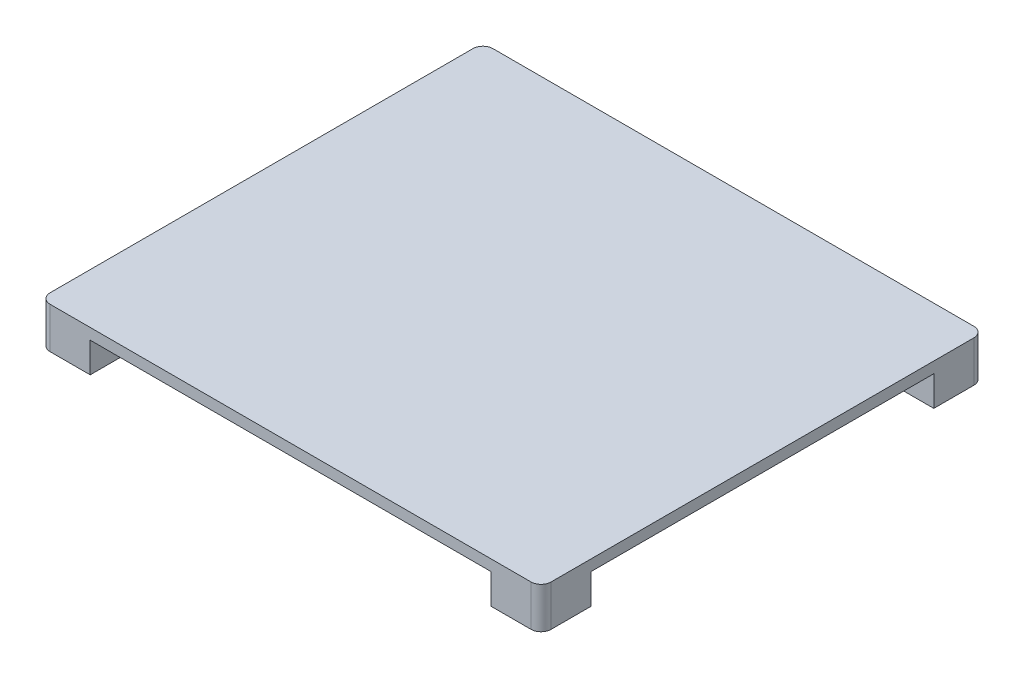
ISO-10303-21;
HEADER;
FILE_DESCRIPTION(('STEP AP214'),'2;1');
FILE_NAME('part.step','',(''),(''),'','','');
FILE_SCHEMA(('AUTOMOTIVE_DESIGN { 1 0 10303 214 1 1 1 1 }'));
ENDSEC;
DATA;
#1=APPLICATION_CONTEXT('core data for automotive mechanical design processes');
#2=APPLICATION_PROTOCOL_DEFINITION('international standard','automotive_design',2000,#1);
#3=PRODUCT_CONTEXT('',#1,'mechanical');
#4=PRODUCT('Part','Part','',(#3));
#5=PRODUCT_RELATED_PRODUCT_CATEGORY('part','',(#4));
#6=PRODUCT_DEFINITION_FORMATION('','',#4);
#7=PRODUCT_DEFINITION_CONTEXT('part definition',#1,'design');
#8=PRODUCT_DEFINITION('design','',#6,#7);
#9=PRODUCT_DEFINITION_SHAPE('','',#8);
#10=(LENGTH_UNIT() NAMED_UNIT(*) SI_UNIT(.MILLI.,.METRE.));
#11=(NAMED_UNIT(*) PLANE_ANGLE_UNIT() SI_UNIT($,.RADIAN.));
#12=(NAMED_UNIT(*) SI_UNIT($,.STERADIAN.) SOLID_ANGLE_UNIT());
#13=UNCERTAINTY_MEASURE_WITH_UNIT(LENGTH_MEASURE(1.E-05),#10,'distance_accuracy_value','');
#14=(GEOMETRIC_REPRESENTATION_CONTEXT(3) GLOBAL_UNCERTAINTY_ASSIGNED_CONTEXT((#13)) GLOBAL_UNIT_ASSIGNED_CONTEXT((#10,
#11,#12)) REPRESENTATION_CONTEXT('',''));
#15=CARTESIAN_POINT('',(0.,0.,0.));
#16=DIRECTION('',(0.,0.,1.));
#17=DIRECTION('',(1.,0.,0.));
#18=AXIS2_PLACEMENT_3D('',#15,#16,#17);
#19=CARTESIAN_POINT('',(0.,0.,0.));
#20=DIRECTION('',(0.,-1.,0.));
#21=DIRECTION('',(0.,0.,-1.));
#22=AXIS2_PLACEMENT_3D('',#19,#20,#21);
#23=PLANE('',#22);
#24=DIRECTION('',(0.,0.,1.));
#25=VECTOR('',#24,1.);
#26=CARTESIAN_POINT('',(100.,0.,90.5));
#27=LINE('',#26,#25);
#28=CARTESIAN_POINT('',(100.,0.,90.5));
#29=VERTEX_POINT('',#28);
#30=CARTESIAN_POINT('',(100.,0.,110.5));
#31=VERTEX_POINT('',#30);
#32=EDGE_CURVE('E272',#29,#31,#27,.T.);
#33=ORIENTED_EDGE('',*,*,#32,.T.);
#34=DIRECTION('',(1.,0.,0.));
#35=VECTOR('',#34,1.);
#36=CARTESIAN_POINT('',(-125.,0.,110.5));
#37=LINE('',#36,#35);
#38=CARTESIAN_POINT('',(-100.,0.,110.5));
#39=VERTEX_POINT('',#38);
#40=EDGE_CURVE('E436',#39,#31,#37,.T.);
#41=ORIENTED_EDGE('',*,*,#40,.F.);
#42=DIRECTION('',(0.,0.,1.));
#43=VECTOR('',#42,1.);
#44=CARTESIAN_POINT('',(-100.,0.,110.5));
#45=LINE('',#44,#43);
#46=CARTESIAN_POINT('',(-100.,0.,90.5));
#47=VERTEX_POINT('',#46);
#48=EDGE_CURVE('E395',#47,#39,#45,.T.);
#49=ORIENTED_EDGE('',*,*,#48,.F.);
#50=DIRECTION('',(1.,0.,0.));
#51=VECTOR('',#50,1.);
#52=CARTESIAN_POINT('',(-100.,0.,90.5));
#53=LINE('',#52,#51);
#54=CARTESIAN_POINT('',(-105.,0.,90.5));
#55=VERTEX_POINT('',#54);
#56=EDGE_CURVE('E412',#55,#47,#53,.T.);
#57=ORIENTED_EDGE('',*,*,#56,.F.);
#58=DIRECTION('',(0.,0.,1.));
#59=VECTOR('',#58,1.);
#60=CARTESIAN_POINT('',(-105.,0.,90.5));
#61=LINE('',#60,#59);
#62=CARTESIAN_POINT('',(-105.,0.,85.5));
#63=VERTEX_POINT('',#62);
#64=EDGE_CURVE('E409',#63,#55,#61,.T.);
#65=ORIENTED_EDGE('',*,*,#64,.F.);
#66=DIRECTION('',(1.,0.,0.));
#67=VECTOR('',#66,1.);
#68=CARTESIAN_POINT('',(-105.,0.,85.5));
#69=LINE('',#68,#67);
#70=CARTESIAN_POINT('',(-125.,0.,85.5));
#71=VERTEX_POINT('',#70);
#72=EDGE_CURVE('E391',#71,#63,#69,.T.);
#73=ORIENTED_EDGE('',*,*,#72,.F.);
#74=DIRECTION('',(0.,0.,1.));
#75=VECTOR('',#74,1.);
#76=CARTESIAN_POINT('',(-125.,0.,110.5));
#77=LINE('',#76,#75);
#78=CARTESIAN_POINT('',(-125.,0.,-85.5));
#79=VERTEX_POINT('',#78);
#80=EDGE_CURVE('E450',#79,#71,#77,.T.);
#81=ORIENTED_EDGE('',*,*,#80,.F.);
#82=DIRECTION('',(1.,0.,0.));
#83=VECTOR('',#82,1.);
#84=CARTESIAN_POINT('',(-105.,0.,-85.5));
#85=LINE('',#84,#83);
#86=CARTESIAN_POINT('',(-105.,0.,-85.5));
#87=VERTEX_POINT('',#86);
#88=EDGE_CURVE('E320',#79,#87,#85,.T.);
#89=ORIENTED_EDGE('',*,*,#88,.T.);
#90=DIRECTION('',(0.,0.,-1.));
#91=VECTOR('',#90,1.);
#92=CARTESIAN_POINT('',(-105.,0.,-90.5));
#93=LINE('',#92,#91);
#94=CARTESIAN_POINT('',(-105.,0.,-90.5));
#95=VERTEX_POINT('',#94);
#96=EDGE_CURVE('E341',#87,#95,#93,.T.);
#97=ORIENTED_EDGE('',*,*,#96,.T.);
#98=DIRECTION('',(1.,0.,0.));
#99=VECTOR('',#98,1.);
#100=CARTESIAN_POINT('',(-100.,0.,-90.5));
#101=LINE('',#100,#99);
#102=CARTESIAN_POINT('',(-100.,0.,-90.5));
#103=VERTEX_POINT('',#102);
#104=EDGE_CURVE('E338',#95,#103,#101,.T.);
#105=ORIENTED_EDGE('',*,*,#104,.T.);
#106=DIRECTION('',(0.,0.,-1.));
#107=VECTOR('',#106,1.);
#108=CARTESIAN_POINT('',(-100.,0.,-110.5));
#109=LINE('',#108,#107);
#110=CARTESIAN_POINT('',(-100.,0.,-110.5));
#111=VERTEX_POINT('',#110);
#112=EDGE_CURVE('E316',#103,#111,#109,.T.);
#113=ORIENTED_EDGE('',*,*,#112,.T.);
#114=DIRECTION('',(-1.,0.,0.));
#115=VECTOR('',#114,1.);
#116=CARTESIAN_POINT('',(-125.,0.,-110.5));
#117=LINE('',#116,#115);
#118=CARTESIAN_POINT('',(100.,0.,-110.5));
#119=VERTEX_POINT('',#118);
#120=EDGE_CURVE('E447',#119,#111,#117,.T.);
#121=ORIENTED_EDGE('',*,*,#120,.F.);
#122=DIRECTION('',(0.,0.,-1.));
#123=VECTOR('',#122,1.);
#124=CARTESIAN_POINT('',(100.,0.,-90.5));
#125=LINE('',#124,#123);
#126=CARTESIAN_POINT('',(100.,0.,-90.5));
#127=VERTEX_POINT('',#126);
#128=EDGE_CURVE('E360',#127,#119,#125,.T.);
#129=ORIENTED_EDGE('',*,*,#128,.F.);
#130=DIRECTION('',(-1.,0.,0.));
#131=VECTOR('',#130,1.);
#132=CARTESIAN_POINT('',(105.,0.,-90.5));
#133=LINE('',#132,#131);
#134=CARTESIAN_POINT('',(105.,0.,-90.5));
#135=VERTEX_POINT('',#134);
#136=EDGE_CURVE('E374',#135,#127,#133,.T.);
#137=ORIENTED_EDGE('',*,*,#136,.F.);
#138=DIRECTION('',(0.,0.,-1.));
#139=VECTOR('',#138,1.);
#140=CARTESIAN_POINT('',(105.,0.,-85.5));
#141=LINE('',#140,#139);
#142=CARTESIAN_POINT('',(105.,0.,-85.5));
#143=VERTEX_POINT('',#142);
#144=EDGE_CURVE('E372',#143,#135,#141,.T.);
#145=ORIENTED_EDGE('',*,*,#144,.F.);
#146=DIRECTION('',(-1.,0.,0.));
#147=VECTOR('',#146,1.);
#148=CARTESIAN_POINT('',(125.,0.,-85.5));
#149=LINE('',#148,#147);
#150=CARTESIAN_POINT('',(125.,0.,-85.5));
#151=VERTEX_POINT('',#150);
#152=EDGE_CURVE('E356',#151,#143,#149,.T.);
#153=ORIENTED_EDGE('',*,*,#152,.F.);
#154=DIRECTION('',(0.,0.,-1.));
#155=VECTOR('',#154,1.);
#156=CARTESIAN_POINT('',(125.,0.,110.5));
#157=LINE('',#156,#155);
#158=CARTESIAN_POINT('',(125.,0.,85.5));
#159=VERTEX_POINT('',#158);
#160=EDGE_CURVE('E431',#159,#151,#157,.T.);
#161=ORIENTED_EDGE('',*,*,#160,.F.);
#162=DIRECTION('',(-1.,0.,0.));
#163=VECTOR('',#162,1.);
#164=CARTESIAN_POINT('',(125.,0.,85.5));
#165=LINE('',#164,#163);
#166=CARTESIAN_POINT('',(105.,0.,85.5));
#167=VERTEX_POINT('',#166);
#168=EDGE_CURVE('E285',#159,#167,#165,.T.);
#169=ORIENTED_EDGE('',*,*,#168,.T.);
#170=DIRECTION('',(0.,0.,1.));
#171=VECTOR('',#170,1.);
#172=CARTESIAN_POINT('',(105.,0.,85.5));
#173=LINE('',#172,#171);
#174=CARTESIAN_POINT('',(105.,0.,90.5));
#175=VERTEX_POINT('',#174);
#176=EDGE_CURVE('E302',#167,#175,#173,.T.);
#177=ORIENTED_EDGE('',*,*,#176,.T.);
#178=DIRECTION('',(-1.,0.,0.));
#179=VECTOR('',#178,1.);
#180=CARTESIAN_POINT('',(105.,0.,90.5));
#181=LINE('',#180,#179);
#182=EDGE_CURVE('E275',#175,#29,#181,.T.);
#183=ORIENTED_EDGE('',*,*,#182,.T.);
#184=EDGE_LOOP('',(#33,#41,#49,#57,#65,#73,#81,#89,#97,#105,#113,#121,#129,#137,#145,#153,#161,
#169,#177,#183));
#185=FACE_BOUND('',#184,.T.);
#186=DIRECTION('',(-1.,0.,0.));
#187=VECTOR('',#186,1.);
#188=CARTESIAN_POINT('',(-75.,0.,50.));
#189=LINE('',#188,#187);
#190=CARTESIAN_POINT('',(75.,0.,50.));
#191=VERTEX_POINT('',#190);
#192=CARTESIAN_POINT('',(-75.,0.,50.));
#193=VERTEX_POINT('',#192);
#194=EDGE_CURVE('E852',#191,#193,#189,.T.);
#195=ORIENTED_EDGE('',*,*,#194,.F.);
#196=DIRECTION('',(0.,0.,1.));
#197=VECTOR('',#196,1.);
#198=CARTESIAN_POINT('',(75.,0.,-50.));
#199=LINE('',#198,#197);
#200=CARTESIAN_POINT('',(75.,0.,-50.));
#201=VERTEX_POINT('',#200);
#202=EDGE_CURVE('E270',#201,#191,#199,.T.);
#203=ORIENTED_EDGE('',*,*,#202,.F.);
#204=DIRECTION('',(1.,0.,0.));
#205=VECTOR('',#204,1.);
#206=CARTESIAN_POINT('',(-75.,0.,-50.));
#207=LINE('',#206,#205);
#208=CARTESIAN_POINT('',(-75.,0.,-50.));
#209=VERTEX_POINT('',#208);
#210=EDGE_CURVE('E266',#209,#201,#207,.T.);
#211=ORIENTED_EDGE('',*,*,#210,.F.);
#212=DIRECTION('',(0.,0.,-1.));
#213=VECTOR('',#212,1.);
#214=CARTESIAN_POINT('',(-75.,0.,-50.));
#215=LINE('',#214,#213);
#216=EDGE_CURVE('E850',#193,#209,#215,.T.);
#217=ORIENTED_EDGE('',*,*,#216,.F.);
#218=EDGE_LOOP('',(#195,#203,#211,#217));
#219=FACE_BOUND('',#218,.T.);
#220=ADVANCED_FACE('F39',(#185,#219),#23,.T.);
#221=CARTESIAN_POINT('',(125.,5.5,110.5));
#222=DIRECTION('',(-1.,0.,0.));
#223=DIRECTION('',(0.,0.,1.));
#224=AXIS2_PLACEMENT_3D('',#221,#222,#223);
#225=PLANE('',#224);
#226=DIRECTION('',(0.,0.,1.));
#227=VECTOR('',#226,1.);
#228=CARTESIAN_POINT('',(125.,-15.,-110.5));
#229=LINE('',#228,#227);
#230=CARTESIAN_POINT('',(125.,-15.,-105.5));
#231=VERTEX_POINT('',#230);
#232=CARTESIAN_POINT('',(125.,-15.,-85.5));
#233=VERTEX_POINT('',#232);
#234=EDGE_CURVE('E359',#231,#233,#229,.T.);
#235=ORIENTED_EDGE('',*,*,#234,.F.);
#236=DIRECTION('',(0.,-1.,0.));
#237=VECTOR('',#236,1.);
#238=CARTESIAN_POINT('',(125.,5.5,-105.5));
#239=LINE('',#238,#237);
#240=CARTESIAN_POINT('',(125.,5.5,-105.5));
#241=VERTEX_POINT('',#240);
#242=EDGE_CURVE('E47',#231,#241,#239,.F.);
#243=ORIENTED_EDGE('',*,*,#242,.T.);
#244=DIRECTION('',(0.,0.,-1.));
#245=VECTOR('',#244,1.);
#246=CARTESIAN_POINT('',(125.,5.5,110.5));
#247=LINE('',#246,#245);
#248=CARTESIAN_POINT('',(125.,5.5,105.5));
#249=VERTEX_POINT('',#248);
#250=EDGE_CURVE('E432',#249,#241,#247,.T.);
#251=ORIENTED_EDGE('',*,*,#250,.F.);
#252=DIRECTION('',(0.,-1.,0.));
#253=VECTOR('',#252,1.);
#254=CARTESIAN_POINT('',(125.,5.5,105.5));
#255=LINE('',#254,#253);
#256=CARTESIAN_POINT('',(125.,-15.,105.5));
#257=VERTEX_POINT('',#256);
#258=EDGE_CURVE('E481',#249,#257,#255,.T.);
#259=ORIENTED_EDGE('',*,*,#258,.T.);
#260=DIRECTION('',(0.,0.,-1.));
#261=VECTOR('',#260,1.);
#262=CARTESIAN_POINT('',(125.,-15.,110.5));
#263=LINE('',#262,#261);
#264=CARTESIAN_POINT('',(125.,-15.,85.5));
#265=VERTEX_POINT('',#264);
#266=EDGE_CURVE('E297',#257,#265,#263,.T.);
#267=ORIENTED_EDGE('',*,*,#266,.T.);
#268=DIRECTION('',(0.,1.,0.));
#269=VECTOR('',#268,1.);
#270=CARTESIAN_POINT('',(125.,-15.,85.5));
#271=LINE('',#270,#269);
#272=EDGE_CURVE('E298',#265,#159,#271,.T.);
#273=ORIENTED_EDGE('',*,*,#272,.T.);
#274=ORIENTED_EDGE('',*,*,#160,.T.);
#275=DIRECTION('',(0.,1.,0.));
#276=VECTOR('',#275,1.);
#277=CARTESIAN_POINT('',(125.,-15.,-85.5));
#278=LINE('',#277,#276);
#279=EDGE_CURVE('E388',#233,#151,#278,.T.);
#280=ORIENTED_EDGE('',*,*,#279,.F.);
#281=EDGE_LOOP('',(#235,#243,#251,#259,#267,#273,#274,#280));
#282=FACE_BOUND('',#281,.T.);
#283=ADVANCED_FACE('F485',(#282),#225,.F.);
#284=CARTESIAN_POINT('',(-125.,5.5,-110.5));
#285=DIRECTION('',(0.,0.,1.));
#286=DIRECTION('',(1.,0.,0.));
#287=AXIS2_PLACEMENT_3D('',#284,#285,#286);
#288=PLANE('',#287);
#289=DIRECTION('',(-1.,0.,0.));
#290=VECTOR('',#289,1.);
#291=CARTESIAN_POINT('',(-125.,-15.,-110.5));
#292=LINE('',#291,#290);
#293=CARTESIAN_POINT('',(-100.,-15.,-110.5));
#294=VERTEX_POINT('',#293);
#295=CARTESIAN_POINT('',(-120.,-15.,-110.5));
#296=VERTEX_POINT('',#295);
#297=EDGE_CURVE('E319',#294,#296,#292,.T.);
#298=ORIENTED_EDGE('',*,*,#297,.T.);
#299=DIRECTION('',(0.,-1.,0.));
#300=VECTOR('',#299,1.);
#301=CARTESIAN_POINT('',(-120.,5.5,-110.5));
#302=LINE('',#301,#300);
#303=CARTESIAN_POINT('',(-120.,5.5,-110.5));
#304=VERTEX_POINT('',#303);
#305=EDGE_CURVE('E478',#296,#304,#302,.F.);
#306=ORIENTED_EDGE('',*,*,#305,.T.);
#307=DIRECTION('',(-1.,0.,0.));
#308=VECTOR('',#307,1.);
#309=CARTESIAN_POINT('',(-125.,5.5,-110.5));
#310=LINE('',#309,#308);
#311=CARTESIAN_POINT('',(120.,5.5,-110.5));
#312=VERTEX_POINT('',#311);
#313=EDGE_CURVE('E435',#312,#304,#310,.T.);
#314=ORIENTED_EDGE('',*,*,#313,.F.);
#315=DIRECTION('',(0.,-1.,0.));
#316=VECTOR('',#315,1.);
#317=CARTESIAN_POINT('',(120.,5.5,-110.5));
#318=LINE('',#317,#316);
#319=CARTESIAN_POINT('',(120.,-15.,-110.5));
#320=VERTEX_POINT('',#319);
#321=EDGE_CURVE('E475',#312,#320,#318,.T.);
#322=ORIENTED_EDGE('',*,*,#321,.T.);
#323=DIRECTION('',(1.,0.,0.));
#324=VECTOR('',#323,1.);
#325=CARTESIAN_POINT('',(100.,-15.,-110.5));
#326=LINE('',#325,#324);
#327=CARTESIAN_POINT('',(100.,-15.,-110.5));
#328=VERTEX_POINT('',#327);
#329=EDGE_CURVE('E357',#328,#320,#326,.T.);
#330=ORIENTED_EDGE('',*,*,#329,.F.);
#331=DIRECTION('',(0.,1.,0.));
#332=VECTOR('',#331,1.);
#333=CARTESIAN_POINT('',(100.,-15.,-110.5));
#334=LINE('',#333,#332);
#335=EDGE_CURVE('E370',#328,#119,#334,.T.);
#336=ORIENTED_EDGE('',*,*,#335,.T.);
#337=ORIENTED_EDGE('',*,*,#120,.T.);
#338=DIRECTION('',(0.,1.,0.));
#339=VECTOR('',#338,1.);
#340=CARTESIAN_POINT('',(-100.,-15.,-110.5));
#341=LINE('',#340,#339);
#342=EDGE_CURVE('E354',#294,#111,#341,.T.);
#343=ORIENTED_EDGE('',*,*,#342,.F.);
#344=EDGE_LOOP('',(#298,#306,#314,#322,#330,#336,#337,#343));
#345=FACE_BOUND('',#344,.T.);
#346=ADVANCED_FACE('F497',(#345),#288,.F.);
#347=CARTESIAN_POINT('',(-125.,5.5,110.5));
#348=DIRECTION('',(1.,0.,0.));
#349=DIRECTION('',(0.,0.,-1.));
#350=AXIS2_PLACEMENT_3D('',#347,#348,#349);
#351=PLANE('',#350);
#352=DIRECTION('',(0.,0.,-1.));
#353=VECTOR('',#352,1.);
#354=CARTESIAN_POINT('',(-125.,-15.,85.5));
#355=LINE('',#354,#353);
#356=CARTESIAN_POINT('',(-125.,-15.,105.5));
#357=VERTEX_POINT('',#356);
#358=CARTESIAN_POINT('',(-125.,-15.,85.5));
#359=VERTEX_POINT('',#358);
#360=EDGE_CURVE('E392',#357,#359,#355,.T.);
#361=ORIENTED_EDGE('',*,*,#360,.F.);
#362=DIRECTION('',(0.,-1.,0.));
#363=VECTOR('',#362,1.);
#364=CARTESIAN_POINT('',(-125.,5.5,105.5));
#365=LINE('',#364,#363);
#366=CARTESIAN_POINT('',(-125.,5.5,105.5));
#367=VERTEX_POINT('',#366);
#368=EDGE_CURVE('E463',#357,#367,#365,.F.);
#369=ORIENTED_EDGE('',*,*,#368,.T.);
#370=DIRECTION('',(0.,0.,1.));
#371=VECTOR('',#370,1.);
#372=CARTESIAN_POINT('',(-125.,5.5,110.5));
#373=LINE('',#372,#371);
#374=CARTESIAN_POINT('',(-125.,5.5,-105.5));
#375=VERTEX_POINT('',#374);
#376=EDGE_CURVE('E439',#375,#367,#373,.T.);
#377=ORIENTED_EDGE('',*,*,#376,.F.);
#378=DIRECTION('',(0.,-1.,0.));
#379=VECTOR('',#378,1.);
#380=CARTESIAN_POINT('',(-125.,5.5,-105.5));
#381=LINE('',#380,#379);
#382=CARTESIAN_POINT('',(-125.,-15.,-105.5));
#383=VERTEX_POINT('',#382);
#384=EDGE_CURVE('E460',#375,#383,#381,.T.);
#385=ORIENTED_EDGE('',*,*,#384,.T.);
#386=DIRECTION('',(0.,0.,1.));
#387=VECTOR('',#386,1.);
#388=CARTESIAN_POINT('',(-125.,-15.,-85.5));
#389=LINE('',#388,#387);
#390=CARTESIAN_POINT('',(-125.,-15.,-85.5));
#391=VERTEX_POINT('',#390);
#392=EDGE_CURVE('E317',#383,#391,#389,.T.);
#393=ORIENTED_EDGE('',*,*,#392,.T.);
#394=DIRECTION('',(0.,1.,0.));
#395=VECTOR('',#394,1.);
#396=CARTESIAN_POINT('',(-125.,-15.,-85.5));
#397=LINE('',#396,#395);
#398=EDGE_CURVE('E335',#391,#79,#397,.T.);
#399=ORIENTED_EDGE('',*,*,#398,.T.);
#400=ORIENTED_EDGE('',*,*,#80,.T.);
#401=DIRECTION('',(0.,1.,0.));
#402=VECTOR('',#401,1.);
#403=CARTESIAN_POINT('',(-125.,-15.,85.5));
#404=LINE('',#403,#402);
#405=EDGE_CURVE('E428',#359,#71,#404,.T.);
#406=ORIENTED_EDGE('',*,*,#405,.F.);
#407=EDGE_LOOP('',(#361,#369,#377,#385,#393,#399,#400,#406));
#408=FACE_BOUND('',#407,.T.);
#409=ADVANCED_FACE('F529',(#408),#351,.F.);
#410=CARTESIAN_POINT('',(-125.,5.5,110.5));
#411=DIRECTION('',(0.,0.,-1.));
#412=DIRECTION('',(-1.,0.,0.));
#413=AXIS2_PLACEMENT_3D('',#410,#411,#412);
#414=PLANE('',#413);
#415=DIRECTION('',(1.,0.,0.));
#416=VECTOR('',#415,1.);
#417=CARTESIAN_POINT('',(-125.,5.5,110.5));
#418=LINE('',#417,#416);
#419=CARTESIAN_POINT('',(-120.,5.5,110.5));
#420=VERTEX_POINT('',#419);
#421=CARTESIAN_POINT('',(120.,5.5,110.5));
#422=VERTEX_POINT('',#421);
#423=EDGE_CURVE('E442',#420,#422,#418,.T.);
#424=ORIENTED_EDGE('',*,*,#423,.F.);
#425=DIRECTION('',(0.,-1.,0.));
#426=VECTOR('',#425,1.);
#427=CARTESIAN_POINT('',(-120.,5.5,110.5));
#428=LINE('',#427,#426);
#429=CARTESIAN_POINT('',(-120.,-15.,110.5));
#430=VERTEX_POINT('',#429);
#431=EDGE_CURVE('E455',#420,#430,#428,.T.);
#432=ORIENTED_EDGE('',*,*,#431,.T.);
#433=DIRECTION('',(-1.,0.,0.));
#434=VECTOR('',#433,1.);
#435=CARTESIAN_POINT('',(-125.,-15.,110.5));
#436=LINE('',#435,#434);
#437=CARTESIAN_POINT('',(-100.,-15.,110.5));
#438=VERTEX_POINT('',#437);
#439=EDGE_CURVE('E403',#438,#430,#436,.T.);
#440=ORIENTED_EDGE('',*,*,#439,.F.);
#441=DIRECTION('',(0.,1.,0.));
#442=VECTOR('',#441,1.);
#443=CARTESIAN_POINT('',(-100.,-15.,110.5));
#444=LINE('',#443,#442);
#445=EDGE_CURVE('E406',#438,#39,#444,.T.);
#446=ORIENTED_EDGE('',*,*,#445,.T.);
#447=ORIENTED_EDGE('',*,*,#40,.T.);
#448=DIRECTION('',(0.,1.,0.));
#449=VECTOR('',#448,1.);
#450=CARTESIAN_POINT('',(100.,-15.,110.5));
#451=LINE('',#450,#449);
#452=CARTESIAN_POINT('',(100.,-15.,110.5));
#453=VERTEX_POINT('',#452);
#454=EDGE_CURVE('E314',#453,#31,#451,.T.);
#455=ORIENTED_EDGE('',*,*,#454,.F.);
#456=DIRECTION('',(1.,0.,0.));
#457=VECTOR('',#456,1.);
#458=CARTESIAN_POINT('',(100.,-15.,110.5));
#459=LINE('',#458,#457);
#460=CARTESIAN_POINT('',(120.,-15.,110.5));
#461=VERTEX_POINT('',#460);
#462=EDGE_CURVE('E281',#453,#461,#459,.T.);
#463=ORIENTED_EDGE('',*,*,#462,.T.);
#464=DIRECTION('',(0.,-1.,0.));
#465=VECTOR('',#464,1.);
#466=CARTESIAN_POINT('',(120.,5.5,110.5));
#467=LINE('',#466,#465);
#468=EDGE_CURVE('E445',#461,#422,#467,.F.);
#469=ORIENTED_EDGE('',*,*,#468,.T.);
#470=EDGE_LOOP('',(#424,#432,#440,#446,#447,#455,#463,#469));
#471=FACE_BOUND('',#470,.T.);
#472=ADVANCED_FACE('F539',(#471),#414,.F.);
#473=CARTESIAN_POINT('',(0.,5.5,0.));
#474=DIRECTION('',(0.,-1.,0.));
#475=DIRECTION('',(0.,0.,-1.));
#476=AXIS2_PLACEMENT_3D('',#473,#474,#475);
#477=PLANE('',#476);
#478=ORIENTED_EDGE('',*,*,#376,.T.);
#479=CARTESIAN_POINT('',(-120.,5.5,105.5));
#480=DIRECTION('',(0.,-1.,0.));
#481=DIRECTION('',(0.,0.,-1.));
#482=AXIS2_PLACEMENT_3D('',#479,#480,#481);
#483=CIRCLE('',#482,5.);
#484=EDGE_CURVE('E471',#367,#420,#483,.F.);
#485=ORIENTED_EDGE('',*,*,#484,.T.);
#486=ORIENTED_EDGE('',*,*,#423,.T.);
#487=CARTESIAN_POINT('',(120.,5.5,105.5));
#488=DIRECTION('',(0.,-1.,0.));
#489=DIRECTION('',(0.,0.,-1.));
#490=AXIS2_PLACEMENT_3D('',#487,#488,#489);
#491=CIRCLE('',#490,5.);
#492=EDGE_CURVE('E465',#422,#249,#491,.F.);
#493=ORIENTED_EDGE('',*,*,#492,.T.);
#494=ORIENTED_EDGE('',*,*,#250,.T.);
#495=CARTESIAN_POINT('',(120.,5.5,-105.5));
#496=DIRECTION('',(0.,-1.,0.));
#497=DIRECTION('',(0.,0.,-1.));
#498=AXIS2_PLACEMENT_3D('',#495,#496,#497);
#499=CIRCLE('',#498,5.);
#500=EDGE_CURVE('E467',#241,#312,#499,.F.);
#501=ORIENTED_EDGE('',*,*,#500,.T.);
#502=ORIENTED_EDGE('',*,*,#313,.T.);
#503=CARTESIAN_POINT('',(-120.,5.5,-105.5));
#504=DIRECTION('',(0.,-1.,0.));
#505=DIRECTION('',(0.,0.,-1.));
#506=AXIS2_PLACEMENT_3D('',#503,#504,#505);
#507=CIRCLE('',#506,5.);
#508=EDGE_CURVE('E469',#304,#375,#507,.F.);
#509=ORIENTED_EDGE('',*,*,#508,.T.);
#510=EDGE_LOOP('',(#478,#485,#486,#493,#494,#501,#502,#509));
#511=FACE_BOUND('',#510,.T.);
#512=ADVANCED_FACE('F490',(#511),#477,.F.);
#513=CARTESIAN_POINT('',(-105.,-15.,85.5));
#514=DIRECTION('',(0.,0.,1.));
#515=DIRECTION('',(1.,0.,0.));
#516=AXIS2_PLACEMENT_3D('',#513,#514,#515);
#517=PLANE('',#516);
#518=ORIENTED_EDGE('',*,*,#72,.T.);
#519=DIRECTION('',(0.,1.,0.));
#520=VECTOR('',#519,1.);
#521=CARTESIAN_POINT('',(-105.,-15.,85.5));
#522=LINE('',#521,#520);
#523=CARTESIAN_POINT('',(-105.,-15.,85.5));
#524=VERTEX_POINT('',#523);
#525=EDGE_CURVE('E425',#524,#63,#522,.T.);
#526=ORIENTED_EDGE('',*,*,#525,.F.);
#527=DIRECTION('',(1.,0.,0.));
#528=VECTOR('',#527,1.);
#529=CARTESIAN_POINT('',(-105.,-15.,85.5));
#530=LINE('',#529,#528);
#531=EDGE_CURVE('E394',#359,#524,#530,.T.);
#532=ORIENTED_EDGE('',*,*,#531,.F.);
#533=ORIENTED_EDGE('',*,*,#405,.T.);
#534=EDGE_LOOP('',(#518,#526,#532,#533));
#535=FACE_BOUND('',#534,.T.);
#536=ADVANCED_FACE('F812',(#535),#517,.F.);
#537=CARTESIAN_POINT('',(-105.,-15.,90.5));
#538=DIRECTION('',(-1.,0.,0.));
#539=DIRECTION('',(0.,0.,1.));
#540=AXIS2_PLACEMENT_3D('',#537,#538,#539);
#541=PLANE('',#540);
#542=ORIENTED_EDGE('',*,*,#64,.T.);
#543=DIRECTION('',(0.,1.,0.));
#544=VECTOR('',#543,1.);
#545=CARTESIAN_POINT('',(-105.,-15.,90.5));
#546=LINE('',#545,#544);
#547=CARTESIAN_POINT('',(-105.,-15.,90.5));
#548=VERTEX_POINT('',#547);
#549=EDGE_CURVE('E422',#548,#55,#546,.T.);
#550=ORIENTED_EDGE('',*,*,#549,.F.);
#551=DIRECTION('',(0.,0.,1.));
#552=VECTOR('',#551,1.);
#553=CARTESIAN_POINT('',(-105.,-15.,90.5));
#554=LINE('',#553,#552);
#555=EDGE_CURVE('E397',#524,#548,#554,.T.);
#556=ORIENTED_EDGE('',*,*,#555,.F.);
#557=ORIENTED_EDGE('',*,*,#525,.T.);
#558=EDGE_LOOP('',(#542,#550,#556,#557));
#559=FACE_BOUND('',#558,.T.);
#560=ADVANCED_FACE('F805',(#559),#541,.F.);
#561=CARTESIAN_POINT('',(-100.,-15.,90.5));
#562=DIRECTION('',(0.,0.,1.));
#563=DIRECTION('',(1.,0.,0.));
#564=AXIS2_PLACEMENT_3D('',#561,#562,#563);
#565=PLANE('',#564);
#566=ORIENTED_EDGE('',*,*,#56,.T.);
#567=DIRECTION('',(0.,1.,0.));
#568=VECTOR('',#567,1.);
#569=CARTESIAN_POINT('',(-100.,-15.,90.5));
#570=LINE('',#569,#568);
#571=CARTESIAN_POINT('',(-100.,-15.,90.5));
#572=VERTEX_POINT('',#571);
#573=EDGE_CURVE('E419',#572,#47,#570,.T.);
#574=ORIENTED_EDGE('',*,*,#573,.F.);
#575=DIRECTION('',(1.,0.,0.));
#576=VECTOR('',#575,1.);
#577=CARTESIAN_POINT('',(-100.,-15.,90.5));
#578=LINE('',#577,#576);
#579=EDGE_CURVE('E399',#548,#572,#578,.T.);
#580=ORIENTED_EDGE('',*,*,#579,.F.);
#581=ORIENTED_EDGE('',*,*,#549,.T.);
#582=EDGE_LOOP('',(#566,#574,#580,#581));
#583=FACE_BOUND('',#582,.T.);
#584=ADVANCED_FACE('F798',(#583),#565,.F.);
#585=CARTESIAN_POINT('',(-100.,-15.,110.5));
#586=DIRECTION('',(-1.,0.,0.));
#587=DIRECTION('',(0.,0.,1.));
#588=AXIS2_PLACEMENT_3D('',#585,#586,#587);
#589=PLANE('',#588);
#590=ORIENTED_EDGE('',*,*,#48,.T.);
#591=ORIENTED_EDGE('',*,*,#445,.F.);
#592=DIRECTION('',(0.,0.,1.));
#593=VECTOR('',#592,1.);
#594=CARTESIAN_POINT('',(-100.,-15.,110.5));
#595=LINE('',#594,#593);
#596=EDGE_CURVE('E401',#572,#438,#595,.T.);
#597=ORIENTED_EDGE('',*,*,#596,.F.);
#598=ORIENTED_EDGE('',*,*,#573,.T.);
#599=EDGE_LOOP('',(#590,#591,#597,#598));
#600=FACE_BOUND('',#599,.T.);
#601=ADVANCED_FACE('F547',(#600),#589,.F.);
#602=CARTESIAN_POINT('',(0.,-15.,0.));
#603=DIRECTION('',(0.,1.,0.));
#604=DIRECTION('',(0.,0.,1.));
#605=AXIS2_PLACEMENT_3D('',#602,#603,#604);
#606=PLANE('',#605);
#607=ORIENTED_EDGE('',*,*,#439,.T.);
#608=CARTESIAN_POINT('',(-120.,-15.,105.5));
#609=DIRECTION('',(0.,1.,0.));
#610=DIRECTION('',(0.,0.,1.));
#611=AXIS2_PLACEMENT_3D('',#608,#609,#610);
#612=CIRCLE('',#611,5.);
#613=EDGE_CURVE('E458',#430,#357,#612,.F.);
#614=ORIENTED_EDGE('',*,*,#613,.T.);
#615=ORIENTED_EDGE('',*,*,#360,.T.);
#616=ORIENTED_EDGE('',*,*,#531,.T.);
#617=ORIENTED_EDGE('',*,*,#555,.T.);
#618=ORIENTED_EDGE('',*,*,#579,.T.);
#619=ORIENTED_EDGE('',*,*,#596,.T.);
#620=EDGE_LOOP('',(#607,#614,#615,#616,#617,#618,#619));
#621=FACE_BOUND('',#620,.T.);
#622=ADVANCED_FACE('F541',(#621),#606,.F.);
#623=CARTESIAN_POINT('',(125.,-15.,-85.5));
#624=DIRECTION('',(0.,0.,-1.));
#625=DIRECTION('',(-1.,0.,0.));
#626=AXIS2_PLACEMENT_3D('',#623,#624,#625);
#627=PLANE('',#626);
#628=ORIENTED_EDGE('',*,*,#152,.T.);
#629=DIRECTION('',(0.,1.,0.));
#630=VECTOR('',#629,1.);
#631=CARTESIAN_POINT('',(105.,-15.,-85.5));
#632=LINE('',#631,#630);
#633=CARTESIAN_POINT('',(105.,-15.,-85.5));
#634=VERTEX_POINT('',#633);
#635=EDGE_CURVE('E385',#634,#143,#632,.T.);
#636=ORIENTED_EDGE('',*,*,#635,.F.);
#637=DIRECTION('',(-1.,0.,0.));
#638=VECTOR('',#637,1.);
#639=CARTESIAN_POINT('',(125.,-15.,-85.5));
#640=LINE('',#639,#638);
#641=EDGE_CURVE('E362',#233,#634,#640,.T.);
#642=ORIENTED_EDGE('',*,*,#641,.F.);
#643=ORIENTED_EDGE('',*,*,#279,.T.);
#644=EDGE_LOOP('',(#628,#636,#642,#643));
#645=FACE_BOUND('',#644,.T.);
#646=ADVANCED_FACE('F778',(#645),#627,.F.);
#647=CARTESIAN_POINT('',(105.,-15.,-85.5));
#648=DIRECTION('',(1.,0.,0.));
#649=DIRECTION('',(0.,0.,-1.));
#650=AXIS2_PLACEMENT_3D('',#647,#648,#649);
#651=PLANE('',#650);
#652=ORIENTED_EDGE('',*,*,#144,.T.);
#653=DIRECTION('',(0.,1.,0.));
#654=VECTOR('',#653,1.);
#655=CARTESIAN_POINT('',(105.,-15.,-90.5));
#656=LINE('',#655,#654);
#657=CARTESIAN_POINT('',(105.,-15.,-90.5));
#658=VERTEX_POINT('',#657);
#659=EDGE_CURVE('E382',#658,#135,#656,.T.);
#660=ORIENTED_EDGE('',*,*,#659,.F.);
#661=DIRECTION('',(0.,0.,-1.));
#662=VECTOR('',#661,1.);
#663=CARTESIAN_POINT('',(105.,-15.,-85.5));
#664=LINE('',#663,#662);
#665=EDGE_CURVE('E364',#634,#658,#664,.T.);
#666=ORIENTED_EDGE('',*,*,#665,.F.);
#667=ORIENTED_EDGE('',*,*,#635,.T.);
#668=EDGE_LOOP('',(#652,#660,#666,#667));
#669=FACE_BOUND('',#668,.T.);
#670=ADVANCED_FACE('F770',(#669),#651,.F.);
#671=CARTESIAN_POINT('',(105.,-15.,-90.5));
#672=DIRECTION('',(0.,0.,-1.));
#673=DIRECTION('',(-1.,0.,0.));
#674=AXIS2_PLACEMENT_3D('',#671,#672,#673);
#675=PLANE('',#674);
#676=ORIENTED_EDGE('',*,*,#136,.T.);
#677=DIRECTION('',(0.,1.,0.));
#678=VECTOR('',#677,1.);
#679=CARTESIAN_POINT('',(100.,-15.,-90.5));
#680=LINE('',#679,#678);
#681=CARTESIAN_POINT('',(100.,-15.,-90.5));
#682=VERTEX_POINT('',#681);
#683=EDGE_CURVE('E380',#682,#127,#680,.T.);
#684=ORIENTED_EDGE('',*,*,#683,.F.);
#685=DIRECTION('',(-1.,0.,0.));
#686=VECTOR('',#685,1.);
#687=CARTESIAN_POINT('',(105.,-15.,-90.5));
#688=LINE('',#687,#686);
#689=EDGE_CURVE('E366',#658,#682,#688,.T.);
#690=ORIENTED_EDGE('',*,*,#689,.F.);
#691=ORIENTED_EDGE('',*,*,#659,.T.);
#692=EDGE_LOOP('',(#676,#684,#690,#691));
#693=FACE_BOUND('',#692,.T.);
#694=ADVANCED_FACE('F763',(#693),#675,.F.);
#695=CARTESIAN_POINT('',(100.,-15.,-90.5));
#696=DIRECTION('',(1.,0.,0.));
#697=DIRECTION('',(0.,0.,-1.));
#698=AXIS2_PLACEMENT_3D('',#695,#696,#697);
#699=PLANE('',#698);
#700=ORIENTED_EDGE('',*,*,#128,.T.);
#701=ORIENTED_EDGE('',*,*,#335,.F.);
#702=DIRECTION('',(0.,0.,-1.));
#703=VECTOR('',#702,1.);
#704=CARTESIAN_POINT('',(100.,-15.,-90.5));
#705=LINE('',#704,#703);
#706=EDGE_CURVE('E368',#682,#328,#705,.T.);
#707=ORIENTED_EDGE('',*,*,#706,.F.);
#708=ORIENTED_EDGE('',*,*,#683,.T.);
#709=EDGE_LOOP('',(#700,#701,#707,#708));
#710=FACE_BOUND('',#709,.T.);
#711=ADVANCED_FACE('F504',(#710),#699,.F.);
#712=CARTESIAN_POINT('',(0.,-15.,0.));
#713=DIRECTION('',(0.,-1.,0.));
#714=DIRECTION('',(0.,0.,-1.));
#715=AXIS2_PLACEMENT_3D('',#712,#713,#714);
#716=PLANE('',#715);
#717=ORIENTED_EDGE('',*,*,#329,.T.);
#718=CARTESIAN_POINT('',(120.,-15.,-105.5));
#719=DIRECTION('',(0.,-1.,0.));
#720=DIRECTION('',(0.,0.,-1.));
#721=AXIS2_PLACEMENT_3D('',#718,#719,#720);
#722=CIRCLE('',#721,5.);
#723=EDGE_CURVE('E60',#320,#231,#722,.T.);
#724=ORIENTED_EDGE('',*,*,#723,.T.);
#725=ORIENTED_EDGE('',*,*,#234,.T.);
#726=ORIENTED_EDGE('',*,*,#641,.T.);
#727=ORIENTED_EDGE('',*,*,#665,.T.);
#728=ORIENTED_EDGE('',*,*,#689,.T.);
#729=ORIENTED_EDGE('',*,*,#706,.T.);
#730=EDGE_LOOP('',(#717,#724,#725,#726,#727,#728,#729));
#731=FACE_BOUND('',#730,.T.);
#732=ADVANCED_FACE('F498',(#731),#716,.T.);
#733=CARTESIAN_POINT('',(-100.,-15.,-110.5));
#734=DIRECTION('',(1.,0.,0.));
#735=DIRECTION('',(0.,0.,-1.));
#736=AXIS2_PLACEMENT_3D('',#733,#734,#735);
#737=PLANE('',#736);
#738=ORIENTED_EDGE('',*,*,#112,.F.);
#739=DIRECTION('',(0.,1.,0.));
#740=VECTOR('',#739,1.);
#741=CARTESIAN_POINT('',(-100.,-15.,-90.5));
#742=LINE('',#741,#740);
#743=CARTESIAN_POINT('',(-100.,-15.,-90.5));
#744=VERTEX_POINT('',#743);
#745=EDGE_CURVE('E352',#744,#103,#742,.T.);
#746=ORIENTED_EDGE('',*,*,#745,.F.);
#747=DIRECTION('',(0.,0.,-1.));
#748=VECTOR('',#747,1.);
#749=CARTESIAN_POINT('',(-100.,-15.,-110.5));
#750=LINE('',#749,#748);
#751=EDGE_CURVE('E323',#744,#294,#750,.T.);
#752=ORIENTED_EDGE('',*,*,#751,.T.);
#753=ORIENTED_EDGE('',*,*,#342,.T.);
#754=EDGE_LOOP('',(#738,#746,#752,#753));
#755=FACE_BOUND('',#754,.T.);
#756=ADVANCED_FACE('F513',(#755),#737,.T.);
#757=CARTESIAN_POINT('',(-100.,-15.,-90.5));
#758=DIRECTION('',(0.,0.,1.));
#759=DIRECTION('',(1.,0.,0.));
#760=AXIS2_PLACEMENT_3D('',#757,#758,#759);
#761=PLANE('',#760);
#762=ORIENTED_EDGE('',*,*,#104,.F.);
#763=DIRECTION('',(0.,1.,0.));
#764=VECTOR('',#763,1.);
#765=CARTESIAN_POINT('',(-105.,-15.,-90.5));
#766=LINE('',#765,#764);
#767=CARTESIAN_POINT('',(-105.,-15.,-90.5));
#768=VERTEX_POINT('',#767);
#769=EDGE_CURVE('E350',#768,#95,#766,.T.);
#770=ORIENTED_EDGE('',*,*,#769,.F.);
#771=DIRECTION('',(1.,0.,0.));
#772=VECTOR('',#771,1.);
#773=CARTESIAN_POINT('',(-100.,-15.,-90.5));
#774=LINE('',#773,#772);
#775=EDGE_CURVE('E326',#768,#744,#774,.T.);
#776=ORIENTED_EDGE('',*,*,#775,.T.);
#777=ORIENTED_EDGE('',*,*,#745,.T.);
#778=EDGE_LOOP('',(#762,#770,#776,#777));
#779=FACE_BOUND('',#778,.T.);
#780=ADVANCED_FACE('F701',(#779),#761,.T.);
#781=CARTESIAN_POINT('',(-105.,-15.,-90.5));
#782=DIRECTION('',(1.,0.,0.));
#783=DIRECTION('',(0.,0.,-1.));
#784=AXIS2_PLACEMENT_3D('',#781,#782,#783);
#785=PLANE('',#784);
#786=ORIENTED_EDGE('',*,*,#96,.F.);
#787=DIRECTION('',(0.,1.,0.));
#788=VECTOR('',#787,1.);
#789=CARTESIAN_POINT('',(-105.,-15.,-85.5));
#790=LINE('',#789,#788);
#791=CARTESIAN_POINT('',(-105.,-15.,-85.5));
#792=VERTEX_POINT('',#791);
#793=EDGE_CURVE('E348',#792,#87,#790,.T.);
#794=ORIENTED_EDGE('',*,*,#793,.F.);
#795=DIRECTION('',(0.,0.,-1.));
#796=VECTOR('',#795,1.);
#797=CARTESIAN_POINT('',(-105.,-15.,-90.5));
#798=LINE('',#797,#796);
#799=EDGE_CURVE('E329',#792,#768,#798,.T.);
#800=ORIENTED_EDGE('',*,*,#799,.T.);
#801=ORIENTED_EDGE('',*,*,#769,.T.);
#802=EDGE_LOOP('',(#786,#794,#800,#801));
#803=FACE_BOUND('',#802,.T.);
#804=ADVANCED_FACE('F693',(#803),#785,.T.);
#805=CARTESIAN_POINT('',(-105.,-15.,-85.5));
#806=DIRECTION('',(0.,0.,1.));
#807=DIRECTION('',(1.,0.,0.));
#808=AXIS2_PLACEMENT_3D('',#805,#806,#807);
#809=PLANE('',#808);
#810=ORIENTED_EDGE('',*,*,#88,.F.);
#811=ORIENTED_EDGE('',*,*,#398,.F.);
#812=DIRECTION('',(1.,0.,0.));
#813=VECTOR('',#812,1.);
#814=CARTESIAN_POINT('',(-105.,-15.,-85.5));
#815=LINE('',#814,#813);
#816=EDGE_CURVE('E332',#391,#792,#815,.T.);
#817=ORIENTED_EDGE('',*,*,#816,.T.);
#818=ORIENTED_EDGE('',*,*,#793,.T.);
#819=EDGE_LOOP('',(#810,#811,#817,#818));
#820=FACE_BOUND('',#819,.T.);
#821=ADVANCED_FACE('F686',(#820),#809,.T.);
#822=CARTESIAN_POINT('',(0.,-15.,0.));
#823=DIRECTION('',(0.,1.,0.));
#824=DIRECTION('',(0.,0.,-1.));
#825=AXIS2_PLACEMENT_3D('',#822,#823,#824);
#826=PLANE('',#825);
#827=ORIENTED_EDGE('',*,*,#392,.F.);
#828=CARTESIAN_POINT('',(-120.,-15.,-105.5));
#829=DIRECTION('',(0.,1.,0.));
#830=DIRECTION('',(0.,0.,1.));
#831=AXIS2_PLACEMENT_3D('',#828,#829,#830);
#832=CIRCLE('',#831,5.);
#833=EDGE_CURVE('E473',#383,#296,#832,.F.);
#834=ORIENTED_EDGE('',*,*,#833,.T.);
#835=ORIENTED_EDGE('',*,*,#297,.F.);
#836=ORIENTED_EDGE('',*,*,#751,.F.);
#837=ORIENTED_EDGE('',*,*,#775,.F.);
#838=ORIENTED_EDGE('',*,*,#799,.F.);
#839=ORIENTED_EDGE('',*,*,#816,.F.);
#840=EDGE_LOOP('',(#827,#834,#835,#836,#837,#838,#839));
#841=FACE_BOUND('',#840,.T.);
#842=ADVANCED_FACE('F519',(#841),#826,.F.);
#843=CARTESIAN_POINT('',(100.,-15.,90.5));
#844=DIRECTION('',(-1.,0.,0.));
#845=DIRECTION('',(0.,0.,1.));
#846=AXIS2_PLACEMENT_3D('',#843,#844,#845);
#847=PLANE('',#846);
#848=ORIENTED_EDGE('',*,*,#32,.F.);
#849=DIRECTION('',(0.,1.,0.));
#850=VECTOR('',#849,1.);
#851=CARTESIAN_POINT('',(100.,-15.,90.5));
#852=LINE('',#851,#850);
#853=CARTESIAN_POINT('',(100.,-15.,90.5));
#854=VERTEX_POINT('',#853);
#855=EDGE_CURVE('E312',#854,#29,#852,.T.);
#856=ORIENTED_EDGE('',*,*,#855,.F.);
#857=DIRECTION('',(0.,0.,1.));
#858=VECTOR('',#857,1.);
#859=CARTESIAN_POINT('',(100.,-15.,90.5));
#860=LINE('',#859,#858);
#861=EDGE_CURVE('E284',#854,#453,#860,.T.);
#862=ORIENTED_EDGE('',*,*,#861,.T.);
#863=ORIENTED_EDGE('',*,*,#454,.T.);
#864=EDGE_LOOP('',(#848,#856,#862,#863));
#865=FACE_BOUND('',#864,.T.);
#866=ADVANCED_FACE('F552',(#865),#847,.T.);
#867=CARTESIAN_POINT('',(105.,-15.,90.5));
#868=DIRECTION('',(0.,0.,-1.));
#869=DIRECTION('',(-1.,0.,0.));
#870=AXIS2_PLACEMENT_3D('',#867,#868,#869);
#871=PLANE('',#870);
#872=ORIENTED_EDGE('',*,*,#182,.F.);
#873=DIRECTION('',(0.,1.,0.));
#874=VECTOR('',#873,1.);
#875=CARTESIAN_POINT('',(105.,-15.,90.5));
#876=LINE('',#875,#874);
#877=CARTESIAN_POINT('',(105.,-15.,90.5));
#878=VERTEX_POINT('',#877);
#879=EDGE_CURVE('E310',#878,#175,#876,.T.);
#880=ORIENTED_EDGE('',*,*,#879,.F.);
#881=DIRECTION('',(-1.,0.,0.));
#882=VECTOR('',#881,1.);
#883=CARTESIAN_POINT('',(105.,-15.,90.5));
#884=LINE('',#883,#882);
#885=EDGE_CURVE('E288',#878,#854,#884,.T.);
#886=ORIENTED_EDGE('',*,*,#885,.T.);
#887=ORIENTED_EDGE('',*,*,#855,.T.);
#888=EDGE_LOOP('',(#872,#880,#886,#887));
#889=FACE_BOUND('',#888,.T.);
#890=ADVANCED_FACE('F560',(#889),#871,.T.);
#891=CARTESIAN_POINT('',(105.,-15.,85.5));
#892=DIRECTION('',(-1.,0.,0.));
#893=DIRECTION('',(0.,0.,1.));
#894=AXIS2_PLACEMENT_3D('',#891,#892,#893);
#895=PLANE('',#894);
#896=ORIENTED_EDGE('',*,*,#176,.F.);
#897=DIRECTION('',(0.,1.,0.));
#898=VECTOR('',#897,1.);
#899=CARTESIAN_POINT('',(105.,-15.,85.5));
#900=LINE('',#899,#898);
#901=CARTESIAN_POINT('',(105.,-15.,85.5));
#902=VERTEX_POINT('',#901);
#903=EDGE_CURVE('E308',#902,#167,#900,.T.);
#904=ORIENTED_EDGE('',*,*,#903,.F.);
#905=DIRECTION('',(0.,0.,1.));
#906=VECTOR('',#905,1.);
#907=CARTESIAN_POINT('',(105.,-15.,85.5));
#908=LINE('',#907,#906);
#909=EDGE_CURVE('E291',#902,#878,#908,.T.);
#910=ORIENTED_EDGE('',*,*,#909,.T.);
#911=ORIENTED_EDGE('',*,*,#879,.T.);
#912=EDGE_LOOP('',(#896,#904,#910,#911));
#913=FACE_BOUND('',#912,.T.);
#914=ADVANCED_FACE('F563',(#913),#895,.T.);
#915=CARTESIAN_POINT('',(125.,-15.,85.5));
#916=DIRECTION('',(0.,0.,-1.));
#917=DIRECTION('',(-1.,0.,0.));
#918=AXIS2_PLACEMENT_3D('',#915,#916,#917);
#919=PLANE('',#918);
#920=ORIENTED_EDGE('',*,*,#168,.F.);
#921=ORIENTED_EDGE('',*,*,#272,.F.);
#922=DIRECTION('',(-1.,0.,0.));
#923=VECTOR('',#922,1.);
#924=CARTESIAN_POINT('',(125.,-15.,85.5));
#925=LINE('',#924,#923);
#926=EDGE_CURVE('E294',#265,#902,#925,.T.);
#927=ORIENTED_EDGE('',*,*,#926,.T.);
#928=ORIENTED_EDGE('',*,*,#903,.T.);
#929=EDGE_LOOP('',(#920,#921,#927,#928));
#930=FACE_BOUND('',#929,.T.);
#931=ADVANCED_FACE('F568',(#930),#919,.T.);
#932=CARTESIAN_POINT('',(0.,-15.,0.));
#933=DIRECTION('',(0.,-1.,0.));
#934=DIRECTION('',(0.,0.,1.));
#935=AXIS2_PLACEMENT_3D('',#932,#933,#934);
#936=PLANE('',#935);
#937=ORIENTED_EDGE('',*,*,#266,.F.);
#938=CARTESIAN_POINT('',(120.,-15.,105.5));
#939=DIRECTION('',(0.,-1.,0.));
#940=DIRECTION('',(0.,0.,-1.));
#941=AXIS2_PLACEMENT_3D('',#938,#939,#940);
#942=CIRCLE('',#941,5.);
#943=EDGE_CURVE('E11',#257,#461,#942,.T.);
#944=ORIENTED_EDGE('',*,*,#943,.T.);
#945=ORIENTED_EDGE('',*,*,#462,.F.);
#946=ORIENTED_EDGE('',*,*,#861,.F.);
#947=ORIENTED_EDGE('',*,*,#885,.F.);
#948=ORIENTED_EDGE('',*,*,#909,.F.);
#949=ORIENTED_EDGE('',*,*,#926,.F.);
#950=EDGE_LOOP('',(#937,#944,#945,#946,#947,#948,#949));
#951=FACE_BOUND('',#950,.T.);
#952=ADVANCED_FACE('F557',(#951),#936,.T.);
#953=CARTESIAN_POINT('',(75.,-15.,-50.));
#954=DIRECTION('',(-1.,0.,0.));
#955=DIRECTION('',(0.,0.,1.));
#956=AXIS2_PLACEMENT_3D('',#953,#954,#955);
#957=PLANE('',#956);
#958=ORIENTED_EDGE('',*,*,#202,.T.);
#959=DIRECTION('',(0.,1.,0.));
#960=VECTOR('',#959,1.);
#961=CARTESIAN_POINT('',(75.,-15.,50.));
#962=LINE('',#961,#960);
#963=CARTESIAN_POINT('',(75.,-15.,50.));
#964=VERTEX_POINT('',#963);
#965=EDGE_CURVE('E250',#964,#191,#962,.T.);
#966=ORIENTED_EDGE('',*,*,#965,.F.);
#967=DIRECTION('',(0.,0.,1.));
#968=VECTOR('',#967,1.);
#969=CARTESIAN_POINT('',(75.,-15.,-50.));
#970=LINE('',#969,#968);
#971=CARTESIAN_POINT('',(75.,-15.,-50.));
#972=VERTEX_POINT('',#971);
#973=EDGE_CURVE('E257',#972,#964,#970,.T.);
#974=ORIENTED_EDGE('',*,*,#973,.F.);
#975=DIRECTION('',(0.,1.,0.));
#976=VECTOR('',#975,1.);
#977=CARTESIAN_POINT('',(75.,-15.,-50.));
#978=LINE('',#977,#976);
#979=EDGE_CURVE('E857',#972,#201,#978,.T.);
#980=ORIENTED_EDGE('',*,*,#979,.T.);
#981=EDGE_LOOP('',(#958,#966,#974,#980));
#982=FACE_BOUND('',#981,.T.);
#983=ADVANCED_FACE('F268',(#982),#957,.F.);
#984=CARTESIAN_POINT('',(-75.,-15.,50.));
#985=DIRECTION('',(0.,0.,-1.));
#986=DIRECTION('',(-1.,0.,0.));
#987=AXIS2_PLACEMENT_3D('',#984,#985,#986);
#988=PLANE('',#987);
#989=ORIENTED_EDGE('',*,*,#194,.T.);
#990=DIRECTION('',(0.,1.,0.));
#991=VECTOR('',#990,1.);
#992=CARTESIAN_POINT('',(-75.,-15.,50.));
#993=LINE('',#992,#991);
#994=CARTESIAN_POINT('',(-75.,-15.,50.));
#995=VERTEX_POINT('',#994);
#996=EDGE_CURVE('E253',#995,#193,#993,.T.);
#997=ORIENTED_EDGE('',*,*,#996,.F.);
#998=DIRECTION('',(-1.,0.,0.));
#999=VECTOR('',#998,1.);
#1000=CARTESIAN_POINT('',(-75.,-15.,50.));
#1001=LINE('',#1000,#999);
#1002=EDGE_CURVE('E246',#964,#995,#1001,.T.);
#1003=ORIENTED_EDGE('',*,*,#1002,.F.);
#1004=ORIENTED_EDGE('',*,*,#965,.T.);
#1005=EDGE_LOOP('',(#989,#997,#1003,#1004));
#1006=FACE_BOUND('',#1005,.T.);
#1007=ADVANCED_FACE('F248',(#1006),#988,.F.);
#1008=CARTESIAN_POINT('',(-75.,-15.,-50.));
#1009=DIRECTION('',(1.,0.,0.));
#1010=DIRECTION('',(0.,0.,-1.));
#1011=AXIS2_PLACEMENT_3D('',#1008,#1009,#1010);
#1012=PLANE('',#1011);
#1013=ORIENTED_EDGE('',*,*,#216,.T.);
#1014=DIRECTION('',(0.,1.,0.));
#1015=VECTOR('',#1014,1.);
#1016=CARTESIAN_POINT('',(-75.,-15.,-50.));
#1017=LINE('',#1016,#1015);
#1018=CARTESIAN_POINT('',(-75.,-15.,-50.));
#1019=VERTEX_POINT('',#1018);
#1020=EDGE_CURVE('E277',#1019,#209,#1017,.T.);
#1021=ORIENTED_EDGE('',*,*,#1020,.F.);
#1022=DIRECTION('',(0.,0.,-1.));
#1023=VECTOR('',#1022,1.);
#1024=CARTESIAN_POINT('',(-75.,-15.,-50.));
#1025=LINE('',#1024,#1023);
#1026=EDGE_CURVE('E256',#995,#1019,#1025,.T.);
#1027=ORIENTED_EDGE('',*,*,#1026,.F.);
#1028=ORIENTED_EDGE('',*,*,#996,.T.);
#1029=EDGE_LOOP('',(#1013,#1021,#1027,#1028));
#1030=FACE_BOUND('',#1029,.T.);
#1031=ADVANCED_FACE('F629',(#1030),#1012,.F.);
#1032=CARTESIAN_POINT('',(-75.,-15.,-50.));
#1033=DIRECTION('',(0.,0.,1.));
#1034=DIRECTION('',(1.,0.,0.));
#1035=AXIS2_PLACEMENT_3D('',#1032,#1033,#1034);
#1036=PLANE('',#1035);
#1037=ORIENTED_EDGE('',*,*,#210,.T.);
#1038=ORIENTED_EDGE('',*,*,#979,.F.);
#1039=DIRECTION('',(1.,0.,0.));
#1040=VECTOR('',#1039,1.);
#1041=CARTESIAN_POINT('',(-75.,-15.,-50.));
#1042=LINE('',#1041,#1040);
#1043=EDGE_CURVE('E262',#1019,#972,#1042,.T.);
#1044=ORIENTED_EDGE('',*,*,#1043,.F.);
#1045=ORIENTED_EDGE('',*,*,#1020,.T.);
#1046=EDGE_LOOP('',(#1037,#1038,#1044,#1045));
#1047=FACE_BOUND('',#1046,.T.);
#1048=ADVANCED_FACE('F622',(#1047),#1036,.F.);
#1049=CARTESIAN_POINT('',(0.,-15.,0.));
#1050=DIRECTION('',(0.,1.,0.));
#1051=DIRECTION('',(0.,0.,1.));
#1052=AXIS2_PLACEMENT_3D('',#1049,#1050,#1051);
#1053=PLANE('',#1052);
#1054=ORIENTED_EDGE('',*,*,#973,.T.);
#1055=ORIENTED_EDGE('',*,*,#1002,.T.);
#1056=ORIENTED_EDGE('',*,*,#1026,.T.);
#1057=ORIENTED_EDGE('',*,*,#1043,.T.);
#1058=EDGE_LOOP('',(#1054,#1055,#1056,#1057));
#1059=FACE_BOUND('',#1058,.T.);
#1060=ADVANCED_FACE('F260',(#1059),#1053,.F.);
#1061=CARTESIAN_POINT('',(-120.,5.5,105.5));
#1062=DIRECTION('',(0.,-1.,0.));
#1063=DIRECTION('',(0.,0.,-1.));
#1064=AXIS2_PLACEMENT_3D('',#1061,#1062,#1063);
#1065=CYLINDRICAL_SURFACE('',#1064,5.);
#1066=ORIENTED_EDGE('',*,*,#484,.F.);
#1067=ORIENTED_EDGE('',*,*,#368,.F.);
#1068=ORIENTED_EDGE('',*,*,#613,.F.);
#1069=ORIENTED_EDGE('',*,*,#431,.F.);
#1070=EDGE_LOOP('',(#1066,#1067,#1068,#1069));
#1071=FACE_BOUND('',#1070,.T.);
#1072=ADVANCED_FACE('F536',(#1071),#1065,.T.);
#1073=CARTESIAN_POINT('',(-120.,5.5,-105.5));
#1074=DIRECTION('',(0.,-1.,0.));
#1075=DIRECTION('',(0.,0.,-1.));
#1076=AXIS2_PLACEMENT_3D('',#1073,#1074,#1075);
#1077=CYLINDRICAL_SURFACE('',#1076,5.);
#1078=ORIENTED_EDGE('',*,*,#508,.F.);
#1079=ORIENTED_EDGE('',*,*,#305,.F.);
#1080=ORIENTED_EDGE('',*,*,#833,.F.);
#1081=ORIENTED_EDGE('',*,*,#384,.F.);
#1082=EDGE_LOOP('',(#1078,#1079,#1080,#1081));
#1083=FACE_BOUND('',#1082,.T.);
#1084=ADVANCED_FACE('F525',(#1083),#1077,.T.);
#1085=CARTESIAN_POINT('',(120.,5.5,-105.5));
#1086=DIRECTION('',(0.,-1.,0.));
#1087=DIRECTION('',(0.,0.,-1.));
#1088=AXIS2_PLACEMENT_3D('',#1085,#1086,#1087);
#1089=CYLINDRICAL_SURFACE('',#1088,5.);
#1090=ORIENTED_EDGE('',*,*,#500,.F.);
#1091=ORIENTED_EDGE('',*,*,#242,.F.);
#1092=ORIENTED_EDGE('',*,*,#723,.F.);
#1093=ORIENTED_EDGE('',*,*,#321,.F.);
#1094=EDGE_LOOP('',(#1090,#1091,#1092,#1093));
#1095=FACE_BOUND('',#1094,.T.);
#1096=ADVANCED_FACE('F494',(#1095),#1089,.T.);
#1097=CARTESIAN_POINT('',(120.,5.5,105.5));
#1098=DIRECTION('',(0.,-1.,0.));
#1099=DIRECTION('',(0.,0.,-1.));
#1100=AXIS2_PLACEMENT_3D('',#1097,#1098,#1099);
#1101=CYLINDRICAL_SURFACE('',#1100,5.);
#1102=ORIENTED_EDGE('',*,*,#492,.F.);
#1103=ORIENTED_EDGE('',*,*,#468,.F.);
#1104=ORIENTED_EDGE('',*,*,#943,.F.);
#1105=ORIENTED_EDGE('',*,*,#258,.F.);
#1106=EDGE_LOOP('',(#1102,#1103,#1104,#1105));
#1107=FACE_BOUND('',#1106,.T.);
#1108=ADVANCED_FACE('F41',(#1107),#1101,.T.);
#1109=CLOSED_SHELL('',(#220,#283,#346,#409,#472,#512,#536,#560,#584,#601,#622,#646,#670,#694,
#711,#732,#756,#780,#804,#821,#842,#866,#890,#914,#931,#952,#983,#1007,#1031,#1048,#1060,#1072,
#1084,#1096,#1108));
#1110=MANIFOLD_SOLID_BREP('B2',#1109);
#1111=ADVANCED_BREP_SHAPE_REPRESENTATION('',(#18,#1110),#14);
#1112=SHAPE_DEFINITION_REPRESENTATION(#9,#1111);
ENDSEC;
END-ISO-10303-21;
